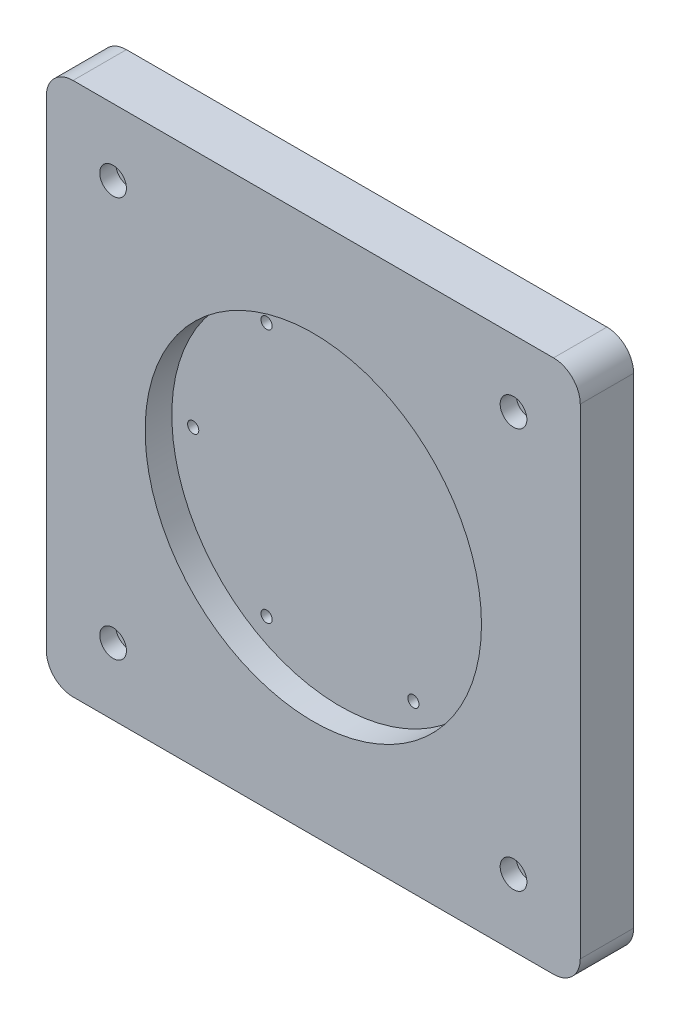
ISO-10303-21;
HEADER;
FILE_DESCRIPTION(('STEP AP214'),'2;1');
FILE_NAME('part.step','',(''),(''),'','','');
FILE_SCHEMA(('AUTOMOTIVE_DESIGN { 1 0 10303 214 1 1 1 1 }'));
ENDSEC;
DATA;
#1=APPLICATION_CONTEXT('core data for automotive mechanical design processes');
#2=APPLICATION_PROTOCOL_DEFINITION('international standard','automotive_design',2000,#1);
#3=PRODUCT_CONTEXT('',#1,'mechanical');
#4=PRODUCT('Part','Part','',(#3));
#5=PRODUCT_RELATED_PRODUCT_CATEGORY('part','',(#4));
#6=PRODUCT_DEFINITION_FORMATION('','',#4);
#7=PRODUCT_DEFINITION_CONTEXT('part definition',#1,'design');
#8=PRODUCT_DEFINITION('design','',#6,#7);
#9=PRODUCT_DEFINITION_SHAPE('','',#8);
#10=(LENGTH_UNIT() NAMED_UNIT(*) SI_UNIT(.MILLI.,.METRE.));
#11=(NAMED_UNIT(*) PLANE_ANGLE_UNIT() SI_UNIT($,.RADIAN.));
#12=(NAMED_UNIT(*) SI_UNIT($,.STERADIAN.) SOLID_ANGLE_UNIT());
#13=UNCERTAINTY_MEASURE_WITH_UNIT(LENGTH_MEASURE(1.E-05),#10,'distance_accuracy_value','');
#14=(GEOMETRIC_REPRESENTATION_CONTEXT(3) GLOBAL_UNCERTAINTY_ASSIGNED_CONTEXT((#13)) GLOBAL_UNIT_ASSIGNED_CONTEXT((#10,
#11,#12)) REPRESENTATION_CONTEXT('',''));
#15=CARTESIAN_POINT('',(0.,0.,0.));
#16=DIRECTION('',(0.,0.,1.));
#17=DIRECTION('',(1.,0.,0.));
#18=AXIS2_PLACEMENT_3D('',#15,#16,#17);
#19=CARTESIAN_POINT('',(75.,75.,-10.));
#20=DIRECTION('',(0.,0.,1.));
#21=DIRECTION('',(1.,0.,0.));
#22=AXIS2_PLACEMENT_3D('',#19,#20,#21);
#23=CYLINDRICAL_SURFACE('',#22,2.75000000000001);
#24=CARTESIAN_POINT('',(75.,75.,-10.));
#25=DIRECTION('',(0.,0.,1.));
#26=DIRECTION('',(1.,0.,0.));
#27=AXIS2_PLACEMENT_3D('',#24,#25,#26);
#28=CIRCLE('',#27,2.75000000000001);
#29=CARTESIAN_POINT('',(77.75,75.,-10.));
#30=VERTEX_POINT('',#29);
#31=EDGE_CURVE('E193',#30,#30,#28,.T.);
#32=ORIENTED_EDGE('',*,*,#31,.F.);
#33=EDGE_LOOP('',(#32));
#34=FACE_BOUND('',#33,.T.);
#35=CARTESIAN_POINT('',(75.,75.,4.));
#36=DIRECTION('',(0.,0.,1.));
#37=DIRECTION('',(1.,0.,0.));
#38=AXIS2_PLACEMENT_3D('',#35,#36,#37);
#39=CIRCLE('',#38,2.75000000000001);
#40=CARTESIAN_POINT('',(77.75,75.,4.));
#41=VERTEX_POINT('',#40);
#42=EDGE_CURVE('E133',#41,#41,#39,.F.);
#43=ORIENTED_EDGE('',*,*,#42,.F.);
#44=EDGE_LOOP('',(#43));
#45=FACE_BOUND('',#44,.T.);
#46=ADVANCED_FACE('F34',(#34,#45),#23,.F.);
#47=CARTESIAN_POINT('',(75.0000000000041,-75.,-10.));
#48=DIRECTION('',(0.,0.,1.));
#49=DIRECTION('',(1.,0.,0.));
#50=AXIS2_PLACEMENT_3D('',#47,#48,#49);
#51=CYLINDRICAL_SURFACE('',#50,2.75000000000001);
#52=CARTESIAN_POINT('',(75.0000000000041,-75.,-10.));
#53=DIRECTION('',(0.,0.,1.));
#54=DIRECTION('',(1.,0.,0.));
#55=AXIS2_PLACEMENT_3D('',#52,#53,#54);
#56=CIRCLE('',#55,2.75000000000001);
#57=CARTESIAN_POINT('',(77.7500000000041,-75.,-10.));
#58=VERTEX_POINT('',#57);
#59=EDGE_CURVE('E189',#58,#58,#56,.T.);
#60=ORIENTED_EDGE('',*,*,#59,.F.);
#61=EDGE_LOOP('',(#60));
#62=FACE_BOUND('',#61,.T.);
#63=CARTESIAN_POINT('',(75.0000000000041,-75.,4.));
#64=DIRECTION('',(0.,0.,1.));
#65=DIRECTION('',(1.,0.,0.));
#66=AXIS2_PLACEMENT_3D('',#63,#64,#65);
#67=CIRCLE('',#66,2.75000000000001);
#68=CARTESIAN_POINT('',(77.7500000000041,-75.,4.));
#69=VERTEX_POINT('',#68);
#70=EDGE_CURVE('E175',#69,#69,#67,.F.);
#71=ORIENTED_EDGE('',*,*,#70,.F.);
#72=EDGE_LOOP('',(#71));
#73=FACE_BOUND('',#72,.T.);
#74=ADVANCED_FACE('F257',(#62,#73),#51,.F.);
#75=CARTESIAN_POINT('',(-74.9999999999959,-75.0000000000041,-10.));
#76=DIRECTION('',(0.,0.,1.));
#77=DIRECTION('',(1.,0.,0.));
#78=AXIS2_PLACEMENT_3D('',#75,#76,#77);
#79=CYLINDRICAL_SURFACE('',#78,2.75000000000001);
#80=CARTESIAN_POINT('',(-74.9999999999959,-75.0000000000041,-10.));
#81=DIRECTION('',(0.,0.,1.));
#82=DIRECTION('',(1.,0.,0.));
#83=AXIS2_PLACEMENT_3D('',#80,#81,#82);
#84=CIRCLE('',#83,2.75000000000001);
#85=CARTESIAN_POINT('',(-72.2499999999959,-75.0000000000041,-10.));
#86=VERTEX_POINT('',#85);
#87=EDGE_CURVE('E184',#86,#86,#84,.T.);
#88=ORIENTED_EDGE('',*,*,#87,.F.);
#89=EDGE_LOOP('',(#88));
#90=FACE_BOUND('',#89,.T.);
#91=CARTESIAN_POINT('',(-74.9999999999959,-75.0000000000041,4.));
#92=DIRECTION('',(0.,0.,1.));
#93=DIRECTION('',(1.,0.,0.));
#94=AXIS2_PLACEMENT_3D('',#91,#92,#93);
#95=CIRCLE('',#94,2.75000000000001);
#96=CARTESIAN_POINT('',(-72.2499999999959,-75.0000000000041,4.));
#97=VERTEX_POINT('',#96);
#98=EDGE_CURVE('E172',#97,#97,#95,.F.);
#99=ORIENTED_EDGE('',*,*,#98,.F.);
#100=EDGE_LOOP('',(#99));
#101=FACE_BOUND('',#100,.T.);
#102=ADVANCED_FACE('F263',(#90,#101),#79,.F.);
#103=CARTESIAN_POINT('',(-75.,74.9999999999959,-10.));
#104=DIRECTION('',(0.,0.,1.));
#105=DIRECTION('',(1.,0.,0.));
#106=AXIS2_PLACEMENT_3D('',#103,#104,#105);
#107=CYLINDRICAL_SURFACE('',#106,2.75000000000001);
#108=CARTESIAN_POINT('',(-75.,74.9999999999959,-10.));
#109=DIRECTION('',(0.,0.,1.));
#110=DIRECTION('',(1.,0.,0.));
#111=AXIS2_PLACEMENT_3D('',#108,#109,#110);
#112=CIRCLE('',#111,2.75000000000001);
#113=CARTESIAN_POINT('',(-72.25,74.9999999999959,-10.));
#114=VERTEX_POINT('',#113);
#115=EDGE_CURVE('E180',#114,#114,#112,.T.);
#116=ORIENTED_EDGE('',*,*,#115,.F.);
#117=EDGE_LOOP('',(#116));
#118=FACE_BOUND('',#117,.T.);
#119=CARTESIAN_POINT('',(-75.,74.9999999999959,4.));
#120=DIRECTION('',(0.,0.,1.));
#121=DIRECTION('',(1.,0.,0.));
#122=AXIS2_PLACEMENT_3D('',#119,#120,#121);
#123=CIRCLE('',#122,2.75000000000001);
#124=CARTESIAN_POINT('',(-72.25,74.9999999999959,4.));
#125=VERTEX_POINT('',#124);
#126=EDGE_CURVE('E169',#125,#125,#123,.F.);
#127=ORIENTED_EDGE('',*,*,#126,.F.);
#128=EDGE_LOOP('',(#127));
#129=FACE_BOUND('',#128,.T.);
#130=ADVANCED_FACE('F270',(#118,#129),#107,.F.);
#131=CARTESIAN_POINT('',(0.,0.,10.));
#132=DIRECTION('',(0.,0.,1.));
#133=DIRECTION('',(1.,0.,0.));
#134=AXIS2_PLACEMENT_3D('',#131,#132,#133);
#135=PLANE('',#134);
#136=CARTESIAN_POINT('',(75.0000000000008,75.0000000000033,10.));
#137=DIRECTION('',(0.,0.,1.));
#138=DIRECTION('',(1.,0.,0.));
#139=AXIS2_PLACEMENT_3D('',#136,#137,#138);
#140=CIRCLE('',#139,5.00000000000001);
#141=CARTESIAN_POINT('',(80.0000000000008,75.0000000000033,10.));
#142=VERTEX_POINT('',#141);
#143=EDGE_CURVE('E342',#142,#142,#140,.T.);
#144=ORIENTED_EDGE('',*,*,#143,.F.);
#145=EDGE_LOOP('',(#144));
#146=FACE_BOUND('',#145,.T.);
#147=CARTESIAN_POINT('',(-75.0000000000036,75.0000000000005,10.));
#148=DIRECTION('',(0.,0.,1.));
#149=DIRECTION('',(1.,0.,0.));
#150=AXIS2_PLACEMENT_3D('',#147,#148,#149);
#151=CIRCLE('',#150,5.00000000000001);
#152=CARTESIAN_POINT('',(-70.0000000000036,75.0000000000005,10.));
#153=VERTEX_POINT('',#152);
#154=EDGE_CURVE('E348',#153,#153,#151,.T.);
#155=ORIENTED_EDGE('',*,*,#154,.F.);
#156=EDGE_LOOP('',(#155));
#157=FACE_BOUND('',#156,.T.);
#158=CARTESIAN_POINT('',(-75.0000000000003,-75.0000000000039,10.));
#159=DIRECTION('',(0.,0.,1.));
#160=DIRECTION('',(1.,0.,0.));
#161=AXIS2_PLACEMENT_3D('',#158,#159,#160);
#162=CIRCLE('',#161,5.00000000000001);
#163=CARTESIAN_POINT('',(-70.0000000000003,-75.0000000000039,10.));
#164=VERTEX_POINT('',#163);
#165=EDGE_CURVE('E354',#164,#164,#162,.T.);
#166=ORIENTED_EDGE('',*,*,#165,.F.);
#167=EDGE_LOOP('',(#166));
#168=FACE_BOUND('',#167,.T.);
#169=CARTESIAN_POINT('',(75.0000000000041,-75.,10.));
#170=DIRECTION('',(0.,0.,1.));
#171=DIRECTION('',(1.,0.,0.));
#172=AXIS2_PLACEMENT_3D('',#169,#170,#171);
#173=CIRCLE('',#172,5.00000000000001);
#174=CARTESIAN_POINT('',(80.0000000000041,-75.,10.));
#175=VERTEX_POINT('',#174);
#176=EDGE_CURVE('E336',#175,#175,#173,.T.);
#177=ORIENTED_EDGE('',*,*,#176,.F.);
#178=EDGE_LOOP('',(#177));
#179=FACE_BOUND('',#178,.T.);
#180=DIRECTION('',(0.,-1.,0.));
#181=VECTOR('',#180,1.);
#182=CARTESIAN_POINT('',(-100.,100.,10.));
#183=LINE('',#182,#181);
#184=CARTESIAN_POINT('',(-100.,90.,10.));
#185=VERTEX_POINT('',#184);
#186=CARTESIAN_POINT('',(-100.,-90.,10.));
#187=VERTEX_POINT('',#186);
#188=EDGE_CURVE('E130',#185,#187,#183,.T.);
#189=ORIENTED_EDGE('',*,*,#188,.T.);
#190=CARTESIAN_POINT('',(-90.,-90.,10.));
#191=DIRECTION('',(0.,0.,1.));
#192=DIRECTION('',(1.,0.,0.));
#193=AXIS2_PLACEMENT_3D('',#190,#191,#192);
#194=CIRCLE('',#193,10.);
#195=CARTESIAN_POINT('',(-90.,-100.,10.));
#196=VERTEX_POINT('',#195);
#197=EDGE_CURVE('E148',#187,#196,#194,.T.);
#198=ORIENTED_EDGE('',*,*,#197,.T.);
#199=DIRECTION('',(1.,0.,0.));
#200=VECTOR('',#199,1.);
#201=CARTESIAN_POINT('',(-100.,-100.,10.));
#202=LINE('',#201,#200);
#203=CARTESIAN_POINT('',(90.,-100.,10.));
#204=VERTEX_POINT('',#203);
#205=EDGE_CURVE('E126',#196,#204,#202,.T.);
#206=ORIENTED_EDGE('',*,*,#205,.T.);
#207=CARTESIAN_POINT('',(90.,-90.,10.));
#208=DIRECTION('',(0.,0.,1.));
#209=DIRECTION('',(1.,0.,0.));
#210=AXIS2_PLACEMENT_3D('',#207,#208,#209);
#211=CIRCLE('',#210,10.);
#212=CARTESIAN_POINT('',(100.,-90.,10.));
#213=VERTEX_POINT('',#212);
#214=EDGE_CURVE('E125',#204,#213,#211,.T.);
#215=ORIENTED_EDGE('',*,*,#214,.T.);
#216=DIRECTION('',(0.,1.,0.));
#217=VECTOR('',#216,1.);
#218=CARTESIAN_POINT('',(100.,100.,10.));
#219=LINE('',#218,#217);
#220=CARTESIAN_POINT('',(100.,90.,10.));
#221=VERTEX_POINT('',#220);
#222=EDGE_CURVE('E157',#213,#221,#219,.T.);
#223=ORIENTED_EDGE('',*,*,#222,.T.);
#224=CARTESIAN_POINT('',(90.,90.,10.));
#225=DIRECTION('',(0.,0.,1.));
#226=DIRECTION('',(1.,0.,0.));
#227=AXIS2_PLACEMENT_3D('',#224,#225,#226);
#228=CIRCLE('',#227,10.);
#229=CARTESIAN_POINT('',(90.,100.,10.));
#230=VERTEX_POINT('',#229);
#231=EDGE_CURVE('E55',#221,#230,#228,.T.);
#232=ORIENTED_EDGE('',*,*,#231,.T.);
#233=DIRECTION('',(-1.,0.,0.));
#234=VECTOR('',#233,1.);
#235=CARTESIAN_POINT('',(-100.,100.,10.));
#236=LINE('',#235,#234);
#237=CARTESIAN_POINT('',(-90.0000000000001,100.,10.));
#238=VERTEX_POINT('',#237);
#239=EDGE_CURVE('E158',#230,#238,#236,.T.);
#240=ORIENTED_EDGE('',*,*,#239,.T.);
#241=CARTESIAN_POINT('',(-90.0000000000001,90.,10.));
#242=DIRECTION('',(0.,0.,1.));
#243=DIRECTION('',(1.,0.,0.));
#244=AXIS2_PLACEMENT_3D('',#241,#242,#243);
#245=CIRCLE('',#244,10.);
#246=EDGE_CURVE('E144',#238,#185,#245,.T.);
#247=ORIENTED_EDGE('',*,*,#246,.T.);
#248=EDGE_LOOP('',(#189,#198,#206,#215,#223,#232,#240,#247));
#249=FACE_BOUND('',#248,.T.);
#250=CARTESIAN_POINT('',(0.,0.,10.));
#251=DIRECTION('',(0.,0.,1.));
#252=DIRECTION('',(1.,0.,0.));
#253=AXIS2_PLACEMENT_3D('',#250,#251,#252);
#254=CIRCLE('',#253,63.);
#255=CARTESIAN_POINT('',(63.,0.,10.));
#256=VERTEX_POINT('',#255);
#257=EDGE_CURVE('E159',#256,#256,#254,.T.);
#258=ORIENTED_EDGE('',*,*,#257,.F.);
#259=EDGE_LOOP('',(#258));
#260=FACE_BOUND('',#259,.T.);
#261=ADVANCED_FACE('F370',(#146,#157,#168,#179,#249,#260),#135,.T.);
#262=CARTESIAN_POINT('',(100.,100.,10.));
#263=DIRECTION('',(-1.,0.,0.));
#264=DIRECTION('',(0.,-1.,0.));
#265=AXIS2_PLACEMENT_3D('',#262,#263,#264);
#266=PLANE('',#265);
#267=ORIENTED_EDGE('',*,*,#222,.F.);
#268=DIRECTION('',(0.,0.,-1.));
#269=VECTOR('',#268,1.);
#270=CARTESIAN_POINT('',(100.,-90.,10.));
#271=LINE('',#270,#269);
#272=CARTESIAN_POINT('',(100.,-90.,-10.));
#273=VERTEX_POINT('',#272);
#274=EDGE_CURVE('E152',#213,#273,#271,.T.);
#275=ORIENTED_EDGE('',*,*,#274,.T.);
#276=DIRECTION('',(0.,-1.,0.));
#277=VECTOR('',#276,1.);
#278=CARTESIAN_POINT('',(100.,100.,-10.));
#279=LINE('',#278,#277);
#280=CARTESIAN_POINT('',(100.,90.,-10.));
#281=VERTEX_POINT('',#280);
#282=EDGE_CURVE('E105',#281,#273,#279,.T.);
#283=ORIENTED_EDGE('',*,*,#282,.F.);
#284=DIRECTION('',(0.,0.,-1.));
#285=VECTOR('',#284,1.);
#286=CARTESIAN_POINT('',(100.,90.,10.));
#287=LINE('',#286,#285);
#288=EDGE_CURVE('E150',#281,#221,#287,.F.);
#289=ORIENTED_EDGE('',*,*,#288,.T.);
#290=EDGE_LOOP('',(#267,#275,#283,#289));
#291=FACE_BOUND('',#290,.T.);
#292=ADVANCED_FACE('F155',(#291),#266,.F.);
#293=CARTESIAN_POINT('',(-100.,100.,10.));
#294=DIRECTION('',(0.,-1.,0.));
#295=DIRECTION('',(0.,0.,-1.));
#296=AXIS2_PLACEMENT_3D('',#293,#294,#295);
#297=PLANE('',#296);
#298=ORIENTED_EDGE('',*,*,#239,.F.);
#299=DIRECTION('',(0.,0.,-1.));
#300=VECTOR('',#299,1.);
#301=CARTESIAN_POINT('',(90.,100.,10.));
#302=LINE('',#301,#300);
#303=CARTESIAN_POINT('',(90.,100.,-10.));
#304=VERTEX_POINT('',#303);
#305=EDGE_CURVE('E11',#230,#304,#302,.T.);
#306=ORIENTED_EDGE('',*,*,#305,.T.);
#307=DIRECTION('',(1.,0.,0.));
#308=VECTOR('',#307,1.);
#309=CARTESIAN_POINT('',(-100.,100.,-10.));
#310=LINE('',#309,#308);
#311=CARTESIAN_POINT('',(-90.0000000000001,100.,-10.));
#312=VERTEX_POINT('',#311);
#313=EDGE_CURVE('E230',#312,#304,#310,.T.);
#314=ORIENTED_EDGE('',*,*,#313,.F.);
#315=DIRECTION('',(0.,0.,-1.));
#316=VECTOR('',#315,1.);
#317=CARTESIAN_POINT('',(-90.0000000000001,100.,10.));
#318=LINE('',#317,#316);
#319=EDGE_CURVE('E42',#312,#238,#318,.F.);
#320=ORIENTED_EDGE('',*,*,#319,.T.);
#321=EDGE_LOOP('',(#298,#306,#314,#320));
#322=FACE_BOUND('',#321,.T.);
#323=ADVANCED_FACE('F386',(#322),#297,.F.);
#324=CARTESIAN_POINT('',(-100.,100.,10.));
#325=DIRECTION('',(1.,0.,0.));
#326=DIRECTION('',(0.,1.,0.));
#327=AXIS2_PLACEMENT_3D('',#324,#325,#326);
#328=PLANE('',#327);
#329=DIRECTION('',(0.,1.,0.));
#330=VECTOR('',#329,1.);
#331=CARTESIAN_POINT('',(-100.,-100.,-10.));
#332=LINE('',#331,#330);
#333=CARTESIAN_POINT('',(-100.,-90.,-10.));
#334=VERTEX_POINT('',#333);
#335=CARTESIAN_POINT('',(-100.,90.,-10.));
#336=VERTEX_POINT('',#335);
#337=EDGE_CURVE('E121',#334,#336,#332,.T.);
#338=ORIENTED_EDGE('',*,*,#337,.F.);
#339=DIRECTION('',(0.,0.,-1.));
#340=VECTOR('',#339,1.);
#341=CARTESIAN_POINT('',(-100.,-90.,10.));
#342=LINE('',#341,#340);
#343=EDGE_CURVE('E142',#334,#187,#342,.F.);
#344=ORIENTED_EDGE('',*,*,#343,.T.);
#345=ORIENTED_EDGE('',*,*,#188,.F.);
#346=DIRECTION('',(0.,0.,-1.));
#347=VECTOR('',#346,1.);
#348=CARTESIAN_POINT('',(-100.,90.,10.));
#349=LINE('',#348,#347);
#350=EDGE_CURVE('E139',#185,#336,#349,.T.);
#351=ORIENTED_EDGE('',*,*,#350,.T.);
#352=EDGE_LOOP('',(#338,#344,#345,#351));
#353=FACE_BOUND('',#352,.T.);
#354=ADVANCED_FACE('F253',(#353),#328,.F.);
#355=CARTESIAN_POINT('',(-100.,-100.,10.));
#356=DIRECTION('',(0.,1.,0.));
#357=DIRECTION('',(0.,0.,1.));
#358=AXIS2_PLACEMENT_3D('',#355,#356,#357);
#359=PLANE('',#358);
#360=ORIENTED_EDGE('',*,*,#205,.F.);
#361=DIRECTION('',(0.,0.,-1.));
#362=VECTOR('',#361,1.);
#363=CARTESIAN_POINT('',(-90.,-100.,10.));
#364=LINE('',#363,#362);
#365=CARTESIAN_POINT('',(-90.,-100.,-10.));
#366=VERTEX_POINT('',#365);
#367=EDGE_CURVE('E120',#196,#366,#364,.T.);
#368=ORIENTED_EDGE('',*,*,#367,.T.);
#369=DIRECTION('',(-1.,0.,0.));
#370=VECTOR('',#369,1.);
#371=CARTESIAN_POINT('',(100.,-100.,-10.));
#372=LINE('',#371,#370);
#373=CARTESIAN_POINT('',(90.,-100.,-10.));
#374=VERTEX_POINT('',#373);
#375=EDGE_CURVE('E103',#374,#366,#372,.T.);
#376=ORIENTED_EDGE('',*,*,#375,.F.);
#377=DIRECTION('',(0.,0.,-1.));
#378=VECTOR('',#377,1.);
#379=CARTESIAN_POINT('',(90.,-100.,10.));
#380=LINE('',#379,#378);
#381=EDGE_CURVE('E117',#374,#204,#380,.F.);
#382=ORIENTED_EDGE('',*,*,#381,.T.);
#383=EDGE_LOOP('',(#360,#368,#376,#382));
#384=FACE_BOUND('',#383,.T.);
#385=ADVANCED_FACE('F116',(#384),#359,.F.);
#386=CARTESIAN_POINT('',(0.,0.,10.));
#387=DIRECTION('',(0.,0.,-1.));
#388=DIRECTION('',(-1.,0.,0.));
#389=AXIS2_PLACEMENT_3D('',#386,#387,#388);
#390=CYLINDRICAL_SURFACE('',#389,63.);
#391=ORIENTED_EDGE('',*,*,#257,.T.);
#392=EDGE_LOOP('',(#391));
#393=FACE_BOUND('',#392,.T.);
#394=CARTESIAN_POINT('',(0.,0.,0.));
#395=DIRECTION('',(0.,0.,1.));
#396=DIRECTION('',(1.,0.,0.));
#397=AXIS2_PLACEMENT_3D('',#394,#395,#396);
#398=CIRCLE('',#397,63.);
#399=CARTESIAN_POINT('',(63.,0.,0.));
#400=VERTEX_POINT('',#399);
#401=EDGE_CURVE('E163',#400,#400,#398,.T.);
#402=ORIENTED_EDGE('',*,*,#401,.F.);
#403=EDGE_LOOP('',(#402));
#404=FACE_BOUND('',#403,.T.);
#405=ADVANCED_FACE('F243',(#393,#404),#390,.F.);
#406=CARTESIAN_POINT('',(0.,0.,0.));
#407=DIRECTION('',(0.,0.,-1.));
#408=DIRECTION('',(-1.,0.,0.));
#409=AXIS2_PLACEMENT_3D('',#406,#407,#408);
#410=PLANE('',#409);
#411=CARTESIAN_POINT('',(55.,1.2490009027033E-13,0.));
#412=DIRECTION('',(0.,0.,1.));
#413=DIRECTION('',(1.,0.,0.));
#414=AXIS2_PLACEMENT_3D('',#411,#412,#413);
#415=CIRCLE('',#414,2.1);
#416=CARTESIAN_POINT('',(57.1,1.2490009027033E-13,0.));
#417=VERTEX_POINT('',#416);
#418=EDGE_CURVE('E196',#417,#417,#415,.T.);
#419=ORIENTED_EDGE('',*,*,#418,.F.);
#420=EDGE_LOOP('',(#419));
#421=FACE_BOUND('',#420,.T.);
#422=CARTESIAN_POINT('',(27.4999999999999,47.6313972081442,0.));
#423=DIRECTION('',(0.,0.,1.));
#424=DIRECTION('',(1.,0.,0.));
#425=AXIS2_PLACEMENT_3D('',#422,#423,#424);
#426=CIRCLE('',#425,2.1);
#427=CARTESIAN_POINT('',(29.5999999999999,47.6313972081442,0.));
#428=VERTEX_POINT('',#427);
#429=EDGE_CURVE('E219',#428,#428,#426,.T.);
#430=ORIENTED_EDGE('',*,*,#429,.F.);
#431=EDGE_LOOP('',(#430));
#432=FACE_BOUND('',#431,.T.);
#433=CARTESIAN_POINT('',(-27.5000000000001,47.6313972081441,0.));
#434=DIRECTION('',(0.,0.,1.));
#435=DIRECTION('',(1.,0.,0.));
#436=AXIS2_PLACEMENT_3D('',#433,#434,#435);
#437=CIRCLE('',#436,2.1);
#438=CARTESIAN_POINT('',(-25.4000000000001,47.6313972081441,0.));
#439=VERTEX_POINT('',#438);
#440=EDGE_CURVE('E213',#439,#439,#437,.T.);
#441=ORIENTED_EDGE('',*,*,#440,.F.);
#442=EDGE_LOOP('',(#441));
#443=FACE_BOUND('',#442,.T.);
#444=CARTESIAN_POINT('',(-55.,-1.00613961606655E-13,0.));
#445=DIRECTION('',(0.,0.,1.));
#446=DIRECTION('',(1.,0.,0.));
#447=AXIS2_PLACEMENT_3D('',#444,#445,#446);
#448=CIRCLE('',#447,2.09999999999999);
#449=CARTESIAN_POINT('',(-52.9,-1.00613961606655E-13,0.));
#450=VERTEX_POINT('',#449);
#451=EDGE_CURVE('E207',#450,#450,#448,.T.);
#452=ORIENTED_EDGE('',*,*,#451,.F.);
#453=EDGE_LOOP('',(#452));
#454=FACE_BOUND('',#453,.T.);
#455=CARTESIAN_POINT('',(-27.4999999999999,-47.6313972081442,0.));
#456=DIRECTION('',(0.,0.,1.));
#457=DIRECTION('',(1.,0.,0.));
#458=AXIS2_PLACEMENT_3D('',#455,#456,#457);
#459=CIRCLE('',#458,2.1);
#460=CARTESIAN_POINT('',(-25.3999999999999,-47.6313972081442,0.));
#461=VERTEX_POINT('',#460);
#462=EDGE_CURVE('E201',#461,#461,#459,.T.);
#463=ORIENTED_EDGE('',*,*,#462,.F.);
#464=EDGE_LOOP('',(#463));
#465=FACE_BOUND('',#464,.T.);
#466=CARTESIAN_POINT('',(27.5000000000001,-47.6313972081441,0.));
#467=DIRECTION('',(0.,0.,1.));
#468=DIRECTION('',(1.,0.,0.));
#469=AXIS2_PLACEMENT_3D('',#466,#467,#468);
#470=CIRCLE('',#469,2.1);
#471=CARTESIAN_POINT('',(29.6000000000001,-47.6313972081441,0.));
#472=VERTEX_POINT('',#471);
#473=EDGE_CURVE('E200',#472,#472,#470,.T.);
#474=ORIENTED_EDGE('',*,*,#473,.F.);
#475=EDGE_LOOP('',(#474));
#476=FACE_BOUND('',#475,.T.);
#477=ORIENTED_EDGE('',*,*,#401,.T.);
#478=EDGE_LOOP('',(#477));
#479=FACE_BOUND('',#478,.T.);
#480=ADVANCED_FACE('F241',(#421,#432,#443,#454,#465,#476,#479),#410,.F.);
#481=CARTESIAN_POINT('',(0.,0.,-10.));
#482=DIRECTION('',(0.,0.,-1.));
#483=DIRECTION('',(-1.,0.,0.));
#484=AXIS2_PLACEMENT_3D('',#481,#482,#483);
#485=PLANE('',#484);
#486=ORIENTED_EDGE('',*,*,#115,.T.);
#487=EDGE_LOOP('',(#486));
#488=FACE_BOUND('',#487,.T.);
#489=ORIENTED_EDGE('',*,*,#87,.T.);
#490=EDGE_LOOP('',(#489));
#491=FACE_BOUND('',#490,.T.);
#492=ORIENTED_EDGE('',*,*,#59,.T.);
#493=EDGE_LOOP('',(#492));
#494=FACE_BOUND('',#493,.T.);
#495=ORIENTED_EDGE('',*,*,#31,.T.);
#496=EDGE_LOOP('',(#495));
#497=FACE_BOUND('',#496,.T.);
#498=CARTESIAN_POINT('',(55.,1.2490009027033E-13,-10.));
#499=DIRECTION('',(0.,0.,1.));
#500=DIRECTION('',(1.,0.,0.));
#501=AXIS2_PLACEMENT_3D('',#498,#499,#500);
#502=CIRCLE('',#501,2.1);
#503=CARTESIAN_POINT('',(57.1,1.2490009027033E-13,-10.));
#504=VERTEX_POINT('',#503);
#505=EDGE_CURVE('E222',#504,#504,#502,.T.);
#506=ORIENTED_EDGE('',*,*,#505,.T.);
#507=EDGE_LOOP('',(#506));
#508=FACE_BOUND('',#507,.T.);
#509=CARTESIAN_POINT('',(27.4999999999999,47.6313972081442,-10.));
#510=DIRECTION('',(0.,0.,1.));
#511=DIRECTION('',(1.,0.,0.));
#512=AXIS2_PLACEMENT_3D('',#509,#510,#511);
#513=CIRCLE('',#512,2.1);
#514=CARTESIAN_POINT('',(29.5999999999999,47.6313972081442,-10.));
#515=VERTEX_POINT('',#514);
#516=EDGE_CURVE('E216',#515,#515,#513,.T.);
#517=ORIENTED_EDGE('',*,*,#516,.T.);
#518=EDGE_LOOP('',(#517));
#519=FACE_BOUND('',#518,.T.);
#520=CARTESIAN_POINT('',(-27.5000000000001,47.6313972081441,-10.));
#521=DIRECTION('',(0.,0.,1.));
#522=DIRECTION('',(1.,0.,0.));
#523=AXIS2_PLACEMENT_3D('',#520,#521,#522);
#524=CIRCLE('',#523,2.1);
#525=CARTESIAN_POINT('',(-25.4000000000001,47.6313972081441,-10.));
#526=VERTEX_POINT('',#525);
#527=EDGE_CURVE('E210',#526,#526,#524,.T.);
#528=ORIENTED_EDGE('',*,*,#527,.T.);
#529=EDGE_LOOP('',(#528));
#530=FACE_BOUND('',#529,.T.);
#531=CARTESIAN_POINT('',(-55.,-1.00613961606655E-13,-10.));
#532=DIRECTION('',(0.,0.,1.));
#533=DIRECTION('',(1.,0.,0.));
#534=AXIS2_PLACEMENT_3D('',#531,#532,#533);
#535=CIRCLE('',#534,2.09999999999999);
#536=CARTESIAN_POINT('',(-52.9,-1.00613961606655E-13,-10.));
#537=VERTEX_POINT('',#536);
#538=EDGE_CURVE('E204',#537,#537,#535,.T.);
#539=ORIENTED_EDGE('',*,*,#538,.T.);
#540=EDGE_LOOP('',(#539));
#541=FACE_BOUND('',#540,.T.);
#542=CARTESIAN_POINT('',(-27.4999999999999,-47.6313972081442,-10.));
#543=DIRECTION('',(0.,0.,1.));
#544=DIRECTION('',(1.,0.,0.));
#545=AXIS2_PLACEMENT_3D('',#542,#543,#544);
#546=CIRCLE('',#545,2.1);
#547=CARTESIAN_POINT('',(-25.3999999999999,-47.6313972081442,-10.));
#548=VERTEX_POINT('',#547);
#549=EDGE_CURVE('E197',#548,#548,#546,.T.);
#550=ORIENTED_EDGE('',*,*,#549,.T.);
#551=EDGE_LOOP('',(#550));
#552=FACE_BOUND('',#551,.T.);
#553=CARTESIAN_POINT('',(27.5000000000001,-47.6313972081441,-10.));
#554=DIRECTION('',(0.,0.,1.));
#555=DIRECTION('',(1.,0.,0.));
#556=AXIS2_PLACEMENT_3D('',#553,#554,#555);
#557=CIRCLE('',#556,2.1);
#558=CARTESIAN_POINT('',(29.6000000000001,-47.6313972081441,-10.));
#559=VERTEX_POINT('',#558);
#560=EDGE_CURVE('E227',#559,#559,#557,.T.);
#561=ORIENTED_EDGE('',*,*,#560,.T.);
#562=EDGE_LOOP('',(#561));
#563=FACE_BOUND('',#562,.T.);
#564=ORIENTED_EDGE('',*,*,#375,.T.);
#565=CARTESIAN_POINT('',(-90.,-90.,-10.));
#566=DIRECTION('',(0.,0.,-1.));
#567=DIRECTION('',(-1.,0.,0.));
#568=AXIS2_PLACEMENT_3D('',#565,#566,#567);
#569=CIRCLE('',#568,10.);
#570=EDGE_CURVE('E110',#366,#334,#569,.T.);
#571=ORIENTED_EDGE('',*,*,#570,.T.);
#572=ORIENTED_EDGE('',*,*,#337,.T.);
#573=CARTESIAN_POINT('',(-90.0000000000001,90.,-10.));
#574=DIRECTION('',(0.,0.,-1.));
#575=DIRECTION('',(-1.,0.,0.));
#576=AXIS2_PLACEMENT_3D('',#573,#574,#575);
#577=CIRCLE('',#576,10.);
#578=EDGE_CURVE('E128',#336,#312,#577,.T.);
#579=ORIENTED_EDGE('',*,*,#578,.T.);
#580=ORIENTED_EDGE('',*,*,#313,.T.);
#581=CARTESIAN_POINT('',(90.,90.,-10.));
#582=DIRECTION('',(0.,0.,-1.));
#583=DIRECTION('',(-1.,0.,0.));
#584=AXIS2_PLACEMENT_3D('',#581,#582,#583);
#585=CIRCLE('',#584,10.);
#586=EDGE_CURVE('E111',#304,#281,#585,.T.);
#587=ORIENTED_EDGE('',*,*,#586,.T.);
#588=ORIENTED_EDGE('',*,*,#282,.T.);
#589=CARTESIAN_POINT('',(90.,-90.,-10.));
#590=DIRECTION('',(0.,0.,-1.));
#591=DIRECTION('',(-1.,0.,0.));
#592=AXIS2_PLACEMENT_3D('',#589,#590,#591);
#593=CIRCLE('',#592,10.);
#594=EDGE_CURVE('E100',#273,#374,#593,.T.);
#595=ORIENTED_EDGE('',*,*,#594,.T.);
#596=EDGE_LOOP('',(#564,#571,#572,#579,#580,#587,#588,#595));
#597=FACE_BOUND('',#596,.T.);
#598=ADVANCED_FACE('F102',(#488,#491,#494,#497,#508,#519,#530,#541,#552,#563,#597),#485,.T.);
#599=CARTESIAN_POINT('',(27.5000000000001,-47.6313972081441,-10.));
#600=DIRECTION('',(0.,0.,1.));
#601=DIRECTION('',(1.,0.,0.));
#602=AXIS2_PLACEMENT_3D('',#599,#600,#601);
#603=CYLINDRICAL_SURFACE('',#602,2.1);
#604=ORIENTED_EDGE('',*,*,#560,.F.);
#605=EDGE_LOOP('',(#604));
#606=FACE_BOUND('',#605,.T.);
#607=ORIENTED_EDGE('',*,*,#473,.T.);
#608=EDGE_LOOP('',(#607));
#609=FACE_BOUND('',#608,.T.);
#610=ADVANCED_FACE('F276',(#606,#609),#603,.F.);
#611=CARTESIAN_POINT('',(-27.4999999999999,-47.6313972081442,-10.));
#612=DIRECTION('',(0.,0.,1.));
#613=DIRECTION('',(1.,0.,0.));
#614=AXIS2_PLACEMENT_3D('',#611,#612,#613);
#615=CYLINDRICAL_SURFACE('',#614,2.1);
#616=ORIENTED_EDGE('',*,*,#549,.F.);
#617=EDGE_LOOP('',(#616));
#618=FACE_BOUND('',#617,.T.);
#619=ORIENTED_EDGE('',*,*,#462,.T.);
#620=EDGE_LOOP('',(#619));
#621=FACE_BOUND('',#620,.T.);
#622=ADVANCED_FACE('F272',(#618,#621),#615,.F.);
#623=CARTESIAN_POINT('',(-55.,-1.00613961606655E-13,-10.));
#624=DIRECTION('',(0.,0.,1.));
#625=DIRECTION('',(1.,0.,0.));
#626=AXIS2_PLACEMENT_3D('',#623,#624,#625);
#627=CYLINDRICAL_SURFACE('',#626,2.09999999999999);
#628=ORIENTED_EDGE('',*,*,#538,.F.);
#629=EDGE_LOOP('',(#628));
#630=FACE_BOUND('',#629,.T.);
#631=ORIENTED_EDGE('',*,*,#451,.T.);
#632=EDGE_LOOP('',(#631));
#633=FACE_BOUND('',#632,.T.);
#634=ADVANCED_FACE('F275',(#630,#633),#627,.F.);
#635=CARTESIAN_POINT('',(-27.5000000000001,47.6313972081441,-10.));
#636=DIRECTION('',(0.,0.,1.));
#637=DIRECTION('',(1.,0.,0.));
#638=AXIS2_PLACEMENT_3D('',#635,#636,#637);
#639=CYLINDRICAL_SURFACE('',#638,2.1);
#640=ORIENTED_EDGE('',*,*,#527,.F.);
#641=EDGE_LOOP('',(#640));
#642=FACE_BOUND('',#641,.T.);
#643=ORIENTED_EDGE('',*,*,#440,.T.);
#644=EDGE_LOOP('',(#643));
#645=FACE_BOUND('',#644,.T.);
#646=ADVANCED_FACE('F280',(#642,#645),#639,.F.);
#647=CARTESIAN_POINT('',(27.4999999999999,47.6313972081442,-10.));
#648=DIRECTION('',(0.,0.,1.));
#649=DIRECTION('',(1.,0.,0.));
#650=AXIS2_PLACEMENT_3D('',#647,#648,#649);
#651=CYLINDRICAL_SURFACE('',#650,2.1);
#652=ORIENTED_EDGE('',*,*,#516,.F.);
#653=EDGE_LOOP('',(#652));
#654=FACE_BOUND('',#653,.T.);
#655=ORIENTED_EDGE('',*,*,#429,.T.);
#656=EDGE_LOOP('',(#655));
#657=FACE_BOUND('',#656,.T.);
#658=ADVANCED_FACE('F284',(#654,#657),#651,.F.);
#659=CARTESIAN_POINT('',(55.,1.2490009027033E-13,-10.));
#660=DIRECTION('',(0.,0.,1.));
#661=DIRECTION('',(1.,0.,0.));
#662=AXIS2_PLACEMENT_3D('',#659,#660,#661);
#663=CYLINDRICAL_SURFACE('',#662,2.1);
#664=ORIENTED_EDGE('',*,*,#505,.F.);
#665=EDGE_LOOP('',(#664));
#666=FACE_BOUND('',#665,.T.);
#667=ORIENTED_EDGE('',*,*,#418,.T.);
#668=EDGE_LOOP('',(#667));
#669=FACE_BOUND('',#668,.T.);
#670=ADVANCED_FACE('F288',(#666,#669),#663,.F.);
#671=CARTESIAN_POINT('',(-75.0000000000036,75.0000000000005,4.));
#672=DIRECTION('',(0.,0.,1.));
#673=DIRECTION('',(1.,0.,0.));
#674=AXIS2_PLACEMENT_3D('',#671,#672,#673);
#675=PLANE('',#674);
#676=CARTESIAN_POINT('',(-75.0000000000036,75.0000000000005,4.));
#677=DIRECTION('',(0.,0.,1.));
#678=DIRECTION('',(1.,0.,0.));
#679=AXIS2_PLACEMENT_3D('',#676,#677,#678);
#680=CIRCLE('',#679,5.00000000000001);
#681=CARTESIAN_POINT('',(-70.0000000000036,75.0000000000005,4.));
#682=VERTEX_POINT('',#681);
#683=EDGE_CURVE('E351',#682,#682,#680,.T.);
#684=ORIENTED_EDGE('',*,*,#683,.T.);
#685=EDGE_LOOP('',(#684));
#686=FACE_BOUND('',#685,.T.);
#687=ORIENTED_EDGE('',*,*,#126,.T.);
#688=EDGE_LOOP('',(#687));
#689=FACE_BOUND('',#688,.T.);
#690=ADVANCED_FACE('F292',(#686,#689),#675,.T.);
#691=CARTESIAN_POINT('',(-75.0000000000036,75.0000000000005,4.));
#692=DIRECTION('',(0.,0.,1.));
#693=DIRECTION('',(1.,0.,0.));
#694=AXIS2_PLACEMENT_3D('',#691,#692,#693);
#695=CYLINDRICAL_SURFACE('',#694,5.00000000000001);
#696=ORIENTED_EDGE('',*,*,#683,.F.);
#697=EDGE_LOOP('',(#696));
#698=FACE_BOUND('',#697,.T.);
#699=ORIENTED_EDGE('',*,*,#154,.T.);
#700=EDGE_LOOP('',(#699));
#701=FACE_BOUND('',#700,.T.);
#702=ADVANCED_FACE('F485',(#698,#701),#695,.F.);
#703=CARTESIAN_POINT('',(-75.0000000000003,-75.0000000000039,4.));
#704=DIRECTION('',(0.,0.,1.));
#705=DIRECTION('',(1.,0.,0.));
#706=AXIS2_PLACEMENT_3D('',#703,#704,#705);
#707=PLANE('',#706);
#708=CARTESIAN_POINT('',(-75.0000000000003,-75.0000000000039,4.));
#709=DIRECTION('',(0.,0.,1.));
#710=DIRECTION('',(1.,0.,0.));
#711=AXIS2_PLACEMENT_3D('',#708,#709,#710);
#712=CIRCLE('',#711,5.00000000000001);
#713=CARTESIAN_POINT('',(-70.0000000000003,-75.0000000000039,4.));
#714=VERTEX_POINT('',#713);
#715=EDGE_CURVE('E339',#714,#714,#712,.T.);
#716=ORIENTED_EDGE('',*,*,#715,.T.);
#717=EDGE_LOOP('',(#716));
#718=FACE_BOUND('',#717,.T.);
#719=ORIENTED_EDGE('',*,*,#98,.T.);
#720=EDGE_LOOP('',(#719));
#721=FACE_BOUND('',#720,.T.);
#722=ADVANCED_FACE('F360',(#718,#721),#707,.T.);
#723=CARTESIAN_POINT('',(-75.0000000000003,-75.0000000000039,4.));
#724=DIRECTION('',(0.,0.,1.));
#725=DIRECTION('',(1.,0.,0.));
#726=AXIS2_PLACEMENT_3D('',#723,#724,#725);
#727=CYLINDRICAL_SURFACE('',#726,5.00000000000001);
#728=ORIENTED_EDGE('',*,*,#715,.F.);
#729=EDGE_LOOP('',(#728));
#730=FACE_BOUND('',#729,.T.);
#731=ORIENTED_EDGE('',*,*,#165,.T.);
#732=EDGE_LOOP('',(#731));
#733=FACE_BOUND('',#732,.T.);
#734=ADVANCED_FACE('F363',(#730,#733),#727,.F.);
#735=CARTESIAN_POINT('',(75.0000000000041,-75.,4.));
#736=DIRECTION('',(0.,0.,1.));
#737=DIRECTION('',(1.,0.,0.));
#738=AXIS2_PLACEMENT_3D('',#735,#736,#737);
#739=PLANE('',#738);
#740=CARTESIAN_POINT('',(75.0000000000041,-75.,4.));
#741=DIRECTION('',(0.,0.,1.));
#742=DIRECTION('',(1.,0.,0.));
#743=AXIS2_PLACEMENT_3D('',#740,#741,#742);
#744=CIRCLE('',#743,5.00000000000001);
#745=CARTESIAN_POINT('',(80.0000000000041,-75.,4.));
#746=VERTEX_POINT('',#745);
#747=EDGE_CURVE('E173',#746,#746,#744,.T.);
#748=ORIENTED_EDGE('',*,*,#747,.T.);
#749=EDGE_LOOP('',(#748));
#750=FACE_BOUND('',#749,.T.);
#751=ORIENTED_EDGE('',*,*,#70,.T.);
#752=EDGE_LOOP('',(#751));
#753=FACE_BOUND('',#752,.T.);
#754=ADVANCED_FACE('F366',(#750,#753),#739,.T.);
#755=CARTESIAN_POINT('',(75.0000000000041,-75.,4.));
#756=DIRECTION('',(0.,0.,1.));
#757=DIRECTION('',(1.,0.,0.));
#758=AXIS2_PLACEMENT_3D('',#755,#756,#757);
#759=CYLINDRICAL_SURFACE('',#758,5.00000000000001);
#760=ORIENTED_EDGE('',*,*,#747,.F.);
#761=EDGE_LOOP('',(#760));
#762=FACE_BOUND('',#761,.T.);
#763=ORIENTED_EDGE('',*,*,#176,.T.);
#764=EDGE_LOOP('',(#763));
#765=FACE_BOUND('',#764,.T.);
#766=ADVANCED_FACE('F459',(#762,#765),#759,.F.);
#767=CARTESIAN_POINT('',(75.0000000000008,75.0000000000033,4.));
#768=DIRECTION('',(0.,0.,1.));
#769=DIRECTION('',(1.,0.,0.));
#770=AXIS2_PLACEMENT_3D('',#767,#768,#769);
#771=PLANE('',#770);
#772=CARTESIAN_POINT('',(75.0000000000008,75.0000000000033,4.));
#773=DIRECTION('',(0.,0.,1.));
#774=DIRECTION('',(1.,0.,0.));
#775=AXIS2_PLACEMENT_3D('',#772,#773,#774);
#776=CIRCLE('',#775,5.00000000000001);
#777=CARTESIAN_POINT('',(80.0000000000008,75.0000000000033,4.));
#778=VERTEX_POINT('',#777);
#779=EDGE_CURVE('E345',#778,#778,#776,.T.);
#780=ORIENTED_EDGE('',*,*,#779,.T.);
#781=EDGE_LOOP('',(#780));
#782=FACE_BOUND('',#781,.T.);
#783=ORIENTED_EDGE('',*,*,#42,.T.);
#784=EDGE_LOOP('',(#783));
#785=FACE_BOUND('',#784,.T.);
#786=ADVANCED_FACE('F451',(#782,#785),#771,.T.);
#787=CARTESIAN_POINT('',(75.0000000000008,75.0000000000033,4.));
#788=DIRECTION('',(0.,0.,1.));
#789=DIRECTION('',(1.,0.,0.));
#790=AXIS2_PLACEMENT_3D('',#787,#788,#789);
#791=CYLINDRICAL_SURFACE('',#790,5.00000000000001);
#792=ORIENTED_EDGE('',*,*,#779,.F.);
#793=EDGE_LOOP('',(#792));
#794=FACE_BOUND('',#793,.T.);
#795=ORIENTED_EDGE('',*,*,#143,.T.);
#796=EDGE_LOOP('',(#795));
#797=FACE_BOUND('',#796,.T.);
#798=ADVANCED_FACE('F399',(#794,#797),#791,.F.);
#799=CARTESIAN_POINT('',(-90.,-90.,10.));
#800=DIRECTION('',(0.,0.,-1.));
#801=DIRECTION('',(-1.,0.,0.));
#802=AXIS2_PLACEMENT_3D('',#799,#800,#801);
#803=CYLINDRICAL_SURFACE('',#802,10.);
#804=ORIENTED_EDGE('',*,*,#197,.F.);
#805=ORIENTED_EDGE('',*,*,#343,.F.);
#806=ORIENTED_EDGE('',*,*,#570,.F.);
#807=ORIENTED_EDGE('',*,*,#367,.F.);
#808=EDGE_LOOP('',(#804,#805,#806,#807));
#809=FACE_BOUND('',#808,.T.);
#810=ADVANCED_FACE('F384',(#809),#803,.T.);
#811=CARTESIAN_POINT('',(90.,-90.,10.));
#812=DIRECTION('',(0.,0.,-1.));
#813=DIRECTION('',(-1.,0.,0.));
#814=AXIS2_PLACEMENT_3D('',#811,#812,#813);
#815=CYLINDRICAL_SURFACE('',#814,10.);
#816=ORIENTED_EDGE('',*,*,#214,.F.);
#817=ORIENTED_EDGE('',*,*,#381,.F.);
#818=ORIENTED_EDGE('',*,*,#594,.F.);
#819=ORIENTED_EDGE('',*,*,#274,.F.);
#820=EDGE_LOOP('',(#816,#817,#818,#819));
#821=FACE_BOUND('',#820,.T.);
#822=ADVANCED_FACE('F124',(#821),#815,.T.);
#823=CARTESIAN_POINT('',(90.,90.,10.));
#824=DIRECTION('',(0.,0.,-1.));
#825=DIRECTION('',(-1.,0.,0.));
#826=AXIS2_PLACEMENT_3D('',#823,#824,#825);
#827=CYLINDRICAL_SURFACE('',#826,10.);
#828=ORIENTED_EDGE('',*,*,#231,.F.);
#829=ORIENTED_EDGE('',*,*,#288,.F.);
#830=ORIENTED_EDGE('',*,*,#586,.F.);
#831=ORIENTED_EDGE('',*,*,#305,.F.);
#832=EDGE_LOOP('',(#828,#829,#830,#831));
#833=FACE_BOUND('',#832,.T.);
#834=ADVANCED_FACE('F389',(#833),#827,.T.);
#835=CARTESIAN_POINT('',(-90.0000000000001,90.,10.));
#836=DIRECTION('',(0.,0.,-1.));
#837=DIRECTION('',(-1.,0.,0.));
#838=AXIS2_PLACEMENT_3D('',#835,#836,#837);
#839=CYLINDRICAL_SURFACE('',#838,10.);
#840=ORIENTED_EDGE('',*,*,#246,.F.);
#841=ORIENTED_EDGE('',*,*,#319,.F.);
#842=ORIENTED_EDGE('',*,*,#578,.F.);
#843=ORIENTED_EDGE('',*,*,#350,.F.);
#844=EDGE_LOOP('',(#840,#841,#842,#843));
#845=FACE_BOUND('',#844,.T.);
#846=ADVANCED_FACE('F36',(#845),#839,.T.);
#847=CLOSED_SHELL('',(#46,#74,#102,#130,#261,#292,#323,#354,#385,#405,#480,#598,#610,#622,#634,
#646,#658,#670,#690,#702,#722,#734,#754,#766,#786,#798,#810,#822,#834,#846));
#848=MANIFOLD_SOLID_BREP('B2',#847);
#849=ADVANCED_BREP_SHAPE_REPRESENTATION('',(#18,#848),#14);
#850=SHAPE_DEFINITION_REPRESENTATION(#9,#849);
ENDSEC;
END-ISO-10303-21;
